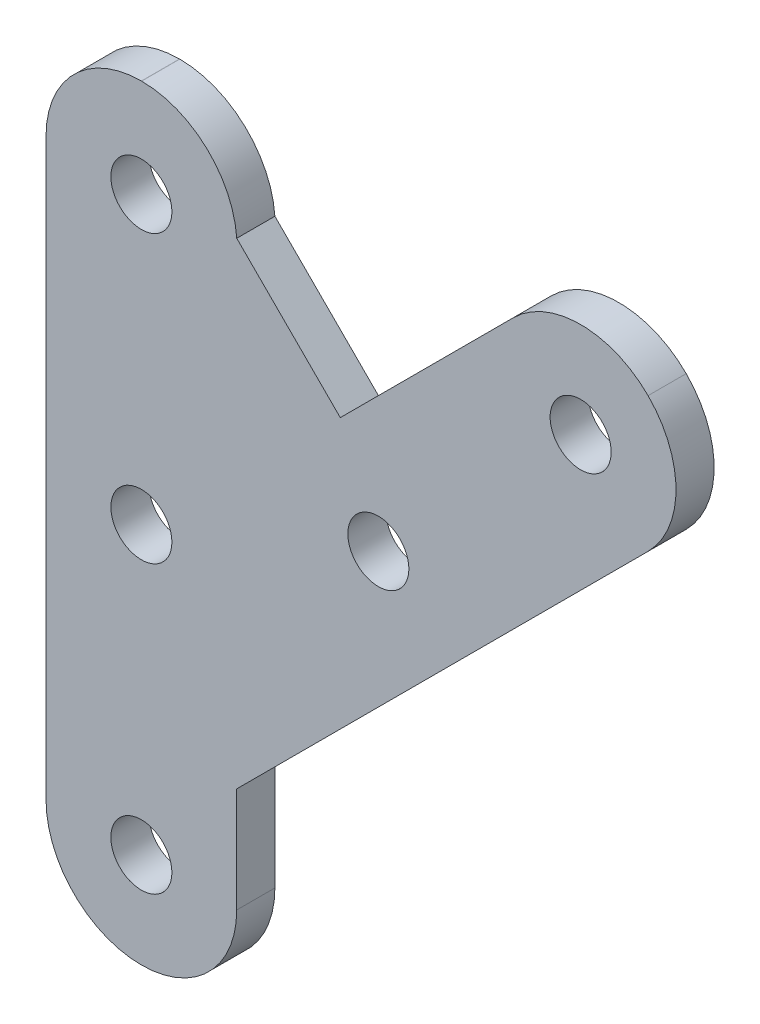
ISO-10303-21;
HEADER;
FILE_DESCRIPTION(('STEP AP214'),'2;1');
FILE_NAME('part.step','',(''),(''),'','','');
FILE_SCHEMA(('AUTOMOTIVE_DESIGN { 1 0 10303 214 1 1 1 1 }'));
ENDSEC;
DATA;
#1=APPLICATION_CONTEXT('core data for automotive mechanical design processes');
#2=APPLICATION_PROTOCOL_DEFINITION('international standard','automotive_design',2000,#1);
#3=PRODUCT_CONTEXT('',#1,'mechanical');
#4=PRODUCT('Part','Part','',(#3));
#5=PRODUCT_RELATED_PRODUCT_CATEGORY('part','',(#4));
#6=PRODUCT_DEFINITION_FORMATION('','',#4);
#7=PRODUCT_DEFINITION_CONTEXT('part definition',#1,'design');
#8=PRODUCT_DEFINITION('design','',#6,#7);
#9=PRODUCT_DEFINITION_SHAPE('','',#8);
#10=(LENGTH_UNIT() NAMED_UNIT(*) SI_UNIT(.MILLI.,.METRE.));
#11=(NAMED_UNIT(*) PLANE_ANGLE_UNIT() SI_UNIT($,.RADIAN.));
#12=(NAMED_UNIT(*) SI_UNIT($,.STERADIAN.) SOLID_ANGLE_UNIT());
#13=UNCERTAINTY_MEASURE_WITH_UNIT(LENGTH_MEASURE(1.E-05),#10,'distance_accuracy_value','');
#14=(GEOMETRIC_REPRESENTATION_CONTEXT(3) GLOBAL_UNCERTAINTY_ASSIGNED_CONTEXT((#13)) GLOBAL_UNIT_ASSIGNED_CONTEXT((#10,
#11,#12)) REPRESENTATION_CONTEXT('',''));
#15=CARTESIAN_POINT('',(0.,0.,0.));
#16=DIRECTION('',(0.,0.,1.));
#17=DIRECTION('',(1.,0.,0.));
#18=AXIS2_PLACEMENT_3D('',#15,#16,#17);
#19=CARTESIAN_POINT('',(0.,20.3649332642843,1.));
#20=DIRECTION('',(0.,-1.,0.));
#21=DIRECTION('',(1.,0.,0.));
#22=AXIS2_PLACEMENT_3D('',#19,#20,#21);
#23=PLANE('',#22);
#24=DIRECTION('',(-1.,0.,0.));
#25=VECTOR('',#24,1.);
#26=CARTESIAN_POINT('',(0.,20.3649332642843,1.));
#27=LINE('',#26,#25);
#28=CARTESIAN_POINT('',(1.18496642914092,20.3649332642843,1.));
#29=VERTEX_POINT('',#28);
#30=CARTESIAN_POINT('',(1.17214329468291,20.3649332642843,1.));
#31=VERTEX_POINT('',#30);
#32=EDGE_CURVE('E176',#29,#31,#27,.T.);
#33=ORIENTED_EDGE('',*,*,#32,.F.);
#34=DIRECTION('',(0.,0.,-1.));
#35=VECTOR('',#34,1.);
#36=CARTESIAN_POINT('',(1.18496642914092,20.3649332642843,1.));
#37=LINE('',#36,#35);
#38=CARTESIAN_POINT('',(1.18496642914092,20.3649332642843,-1.));
#39=VERTEX_POINT('',#38);
#40=EDGE_CURVE('E182',#29,#39,#37,.T.);
#41=ORIENTED_EDGE('',*,*,#40,.T.);
#42=DIRECTION('',(-1.,0.,0.));
#43=VECTOR('',#42,1.);
#44=CARTESIAN_POINT('',(0.,20.3649332642843,-1.));
#45=LINE('',#44,#43);
#46=CARTESIAN_POINT('',(1.17214329468291,20.3649332642843,-1.));
#47=VERTEX_POINT('',#46);
#48=EDGE_CURVE('E161',#39,#47,#45,.T.);
#49=ORIENTED_EDGE('',*,*,#48,.T.);
#50=DIRECTION('',(0.,0.,-1.));
#51=VECTOR('',#50,1.);
#52=CARTESIAN_POINT('',(1.17214329468291,20.3649332642843,1.));
#53=LINE('',#52,#51);
#54=EDGE_CURVE('E146',#47,#31,#53,.F.);
#55=ORIENTED_EDGE('',*,*,#54,.T.);
#56=EDGE_LOOP('',(#33,#41,#49,#55));
#57=FACE_BOUND('',#56,.T.);
#58=ADVANCED_FACE('F40',(#57),#23,.F.);
#59=CARTESIAN_POINT('',(-3.82785670531709,0.,1.));
#60=DIRECTION('',(-1.,0.,0.));
#61=DIRECTION('',(0.,-1.,0.));
#62=AXIS2_PLACEMENT_3D('',#59,#60,#61);
#63=PLANE('',#62);
#64=DIRECTION('',(0.,1.,0.));
#65=VECTOR('',#64,1.);
#66=CARTESIAN_POINT('',(-3.82785670531709,0.,1.));
#67=LINE('',#66,#65);
#68=CARTESIAN_POINT('',(-3.82785670531709,-14.7772023594462,1.));
#69=VERTEX_POINT('',#68);
#70=CARTESIAN_POINT('',(-3.82785670531709,15.3649332642843,1.));
#71=VERTEX_POINT('',#70);
#72=EDGE_CURVE('E136',#69,#71,#67,.T.);
#73=ORIENTED_EDGE('',*,*,#72,.T.);
#74=DIRECTION('',(0.,0.,-1.));
#75=VECTOR('',#74,1.);
#76=CARTESIAN_POINT('',(-3.82785670531709,15.3649332642843,-1.));
#77=LINE('',#76,#75);
#78=CARTESIAN_POINT('',(-3.82785670531709,15.3649332642843,-1.));
#79=VERTEX_POINT('',#78);
#80=EDGE_CURVE('E209',#71,#79,#77,.T.);
#81=ORIENTED_EDGE('',*,*,#80,.T.);
#82=DIRECTION('',(0.,1.,0.));
#83=VECTOR('',#82,1.);
#84=CARTESIAN_POINT('',(-3.82785670531709,0.,-1.));
#85=LINE('',#84,#83);
#86=CARTESIAN_POINT('',(-3.82785670531709,-14.7772023594462,-1.));
#87=VERTEX_POINT('',#86);
#88=EDGE_CURVE('E164',#87,#79,#85,.T.);
#89=ORIENTED_EDGE('',*,*,#88,.F.);
#90=DIRECTION('',(0.,0.,-1.));
#91=VECTOR('',#90,1.);
#92=CARTESIAN_POINT('',(-3.82785670531709,-14.7772023594462,1.));
#93=LINE('',#92,#91);
#94=EDGE_CURVE('E206',#87,#69,#93,.F.);
#95=ORIENTED_EDGE('',*,*,#94,.T.);
#96=EDGE_LOOP('',(#73,#81,#89,#95));
#97=FACE_BOUND('',#96,.T.);
#98=ADVANCED_FACE('F260',(#97),#63,.T.);
#99=CARTESIAN_POINT('',(6.17214329468292,0.,1.));
#100=DIRECTION('',(-1.,0.,0.));
#101=DIRECTION('',(0.,0.,1.));
#102=AXIS2_PLACEMENT_3D('',#99,#100,#101);
#103=PLANE('',#102);
#104=DIRECTION('',(0.,1.,0.));
#105=VECTOR('',#104,1.);
#106=CARTESIAN_POINT('',(6.17214329468292,0.,1.));
#107=LINE('',#106,#105);
#108=CARTESIAN_POINT('',(6.17214329468292,-14.7772023594462,1.));
#109=VERTEX_POINT('',#108);
#110=CARTESIAN_POINT('',(6.17214329468292,-9.27720235944622,1.));
#111=VERTEX_POINT('',#110);
#112=EDGE_CURVE('E126',#109,#111,#107,.T.);
#113=ORIENTED_EDGE('',*,*,#112,.F.);
#114=DIRECTION('',(0.,0.,-1.));
#115=VECTOR('',#114,1.);
#116=CARTESIAN_POINT('',(6.17214329468292,-14.7772023594462,1.));
#117=LINE('',#116,#115);
#118=CARTESIAN_POINT('',(6.17214329468292,-14.7772023594462,-1.));
#119=VERTEX_POINT('',#118);
#120=EDGE_CURVE('E212',#109,#119,#117,.T.);
#121=ORIENTED_EDGE('',*,*,#120,.T.);
#122=DIRECTION('',(0.,1.,0.));
#123=VECTOR('',#122,1.);
#124=CARTESIAN_POINT('',(6.17214329468292,0.,-1.));
#125=LINE('',#124,#123);
#126=CARTESIAN_POINT('',(6.17214329468292,-9.27720235944622,-1.));
#127=VERTEX_POINT('',#126);
#128=EDGE_CURVE('E142',#119,#127,#125,.T.);
#129=ORIENTED_EDGE('',*,*,#128,.T.);
#130=DIRECTION('',(0.,0.,-1.));
#131=VECTOR('',#130,1.);
#132=CARTESIAN_POINT('',(6.17214329468292,-9.27720235944622,1.));
#133=LINE('',#132,#131);
#134=EDGE_CURVE('E139',#111,#127,#133,.T.);
#135=ORIENTED_EDGE('',*,*,#134,.F.);
#136=EDGE_LOOP('',(#113,#121,#129,#135));
#137=FACE_BOUND('',#136,.T.);
#138=ADVANCED_FACE('F140',(#137),#103,.F.);
#139=CARTESIAN_POINT('',(7.72467282706457,-7.72467282706457,1.));
#140=DIRECTION('',(-0.707106781186547,0.707106781186547,0.));
#141=DIRECTION('',(-0.707106781186548,-0.707106781186548,0.));
#142=AXIS2_PLACEMENT_3D('',#139,#140,#141);
#143=PLANE('',#142);
#144=DIRECTION('',(0.707106781186548,0.707106781186548,0.));
#145=VECTOR('',#144,1.);
#146=CARTESIAN_POINT('',(7.72467282706457,-7.72467282706457,-1.));
#147=LINE('',#146,#145);
#148=CARTESIAN_POINT('',(27.7389001208726,12.2895544667435,-1.));
#149=VERTEX_POINT('',#148);
#150=EDGE_CURVE('E169',#127,#149,#147,.T.);
#151=ORIENTED_EDGE('',*,*,#150,.T.);
#152=DIRECTION('',(0.,0.,-1.));
#153=VECTOR('',#152,1.);
#154=CARTESIAN_POINT('',(27.7389001208726,12.2895544667435,1.));
#155=LINE('',#154,#153);
#156=CARTESIAN_POINT('',(27.7389001208726,12.2895544667435,1.));
#157=VERTEX_POINT('',#156);
#158=EDGE_CURVE('E49',#149,#157,#155,.F.);
#159=ORIENTED_EDGE('',*,*,#158,.T.);
#160=DIRECTION('',(0.707106781186548,0.707106781186548,0.));
#161=VECTOR('',#160,1.);
#162=CARTESIAN_POINT('',(7.72467282706457,-7.72467282706457,1.));
#163=LINE('',#162,#161);
#164=EDGE_CURVE('E131',#111,#157,#163,.T.);
#165=ORIENTED_EDGE('',*,*,#164,.F.);
#166=ORIENTED_EDGE('',*,*,#134,.T.);
#167=EDGE_LOOP('',(#151,#159,#165,#166));
#168=FACE_BOUND('',#167,.T.);
#169=ADVANCED_FACE('F150',(#168),#143,.F.);
#170=CARTESIAN_POINT('',(0.653605015199267,-0.653605015199257,1.));
#171=DIRECTION('',(0.707106781186553,-0.707106781186543,0.));
#172=DIRECTION('',(0.707106781186542,0.707106781186553,0.));
#173=AXIS2_PLACEMENT_3D('',#170,#171,#172);
#174=PLANE('',#173);
#175=DIRECTION('',(-0.707106781186542,-0.707106781186553,0.));
#176=VECTOR('',#175,1.);
#177=CARTESIAN_POINT('',(0.653605015199267,-0.653605015199257,1.));
#178=LINE('',#177,#176);
#179=CARTESIAN_POINT('',(20.6678323090071,19.3606222786089,1.));
#180=VERTEX_POINT('',#179);
#181=CARTESIAN_POINT('',(11.6010754828176,10.2938654524192,1.));
#182=VERTEX_POINT('',#181);
#183=EDGE_CURVE('E152',#180,#182,#178,.T.);
#184=ORIENTED_EDGE('',*,*,#183,.F.);
#185=DIRECTION('',(0.,0.,-1.));
#186=VECTOR('',#185,1.);
#187=CARTESIAN_POINT('',(20.6678323090071,19.3606222786089,1.));
#188=LINE('',#187,#186);
#189=CARTESIAN_POINT('',(20.6678323090071,19.3606222786089,-1.));
#190=VERTEX_POINT('',#189);
#191=EDGE_CURVE('E12',#180,#190,#188,.T.);
#192=ORIENTED_EDGE('',*,*,#191,.T.);
#193=DIRECTION('',(-0.707106781186542,-0.707106781186553,0.));
#194=VECTOR('',#193,1.);
#195=CARTESIAN_POINT('',(0.653605015199267,-0.653605015199257,-1.));
#196=LINE('',#195,#194);
#197=CARTESIAN_POINT('',(11.6010754828176,10.2938654524192,-1.));
#198=VERTEX_POINT('',#197);
#199=EDGE_CURVE('E171',#190,#198,#196,.T.);
#200=ORIENTED_EDGE('',*,*,#199,.T.);
#201=DIRECTION('',(0.,0.,-1.));
#202=VECTOR('',#201,1.);
#203=CARTESIAN_POINT('',(11.6010754828176,10.2938654524192,1.));
#204=LINE('',#203,#202);
#205=EDGE_CURVE('E147',#182,#198,#204,.T.);
#206=ORIENTED_EDGE('',*,*,#205,.F.);
#207=EDGE_LOOP('',(#184,#192,#200,#206));
#208=FACE_BOUND('',#207,.T.);
#209=ADVANCED_FACE('F282',(#208),#174,.F.);
#210=CARTESIAN_POINT('',(10.9474704676183,10.9474704676185,1.));
#211=DIRECTION('',(0.707106781186543,0.707106781186553,0.));
#212=DIRECTION('',(-0.707106781186553,0.707106781186542,0.));
#213=AXIS2_PLACEMENT_3D('',#210,#211,#212);
#214=PLANE('',#213);
#215=DIRECTION('',(0.707106781186553,-0.707106781186542,0.));
#216=VECTOR('',#215,1.);
#217=CARTESIAN_POINT('',(10.9474704676183,10.9474704676185,-1.));
#218=LINE('',#217,#216);
#219=CARTESIAN_POINT('',(6.17214329468292,15.7227976405538,-1.));
#220=VERTEX_POINT('',#219);
#221=EDGE_CURVE('E173',#220,#198,#218,.T.);
#222=ORIENTED_EDGE('',*,*,#221,.F.);
#223=DIRECTION('',(0.,0.,-1.));
#224=VECTOR('',#223,1.);
#225=CARTESIAN_POINT('',(6.17214329468292,15.7227976405538,1.));
#226=LINE('',#225,#224);
#227=CARTESIAN_POINT('',(6.17214329468292,15.7227976405538,1.));
#228=VERTEX_POINT('',#227);
#229=EDGE_CURVE('E160',#228,#220,#226,.T.);
#230=ORIENTED_EDGE('',*,*,#229,.F.);
#231=DIRECTION('',(0.707106781186553,-0.707106781186542,0.));
#232=VECTOR('',#231,1.);
#233=CARTESIAN_POINT('',(10.9474704676183,10.9474704676185,1.));
#234=LINE('',#233,#232);
#235=EDGE_CURVE('E154',#228,#182,#234,.T.);
#236=ORIENTED_EDGE('',*,*,#235,.T.);
#237=ORIENTED_EDGE('',*,*,#205,.T.);
#238=EDGE_LOOP('',(#222,#230,#236,#237));
#239=FACE_BOUND('',#238,.T.);
#240=ADVANCED_FACE('F279',(#239),#214,.T.);
#241=CARTESIAN_POINT('',(0.,0.,1.));
#242=DIRECTION('',(0.,0.,1.));
#243=DIRECTION('',(1.,0.,0.));
#244=AXIS2_PLACEMENT_3D('',#241,#242,#243);
#245=PLANE('',#244);
#246=CARTESIAN_POINT('',(1.17142269378928,-14.7772023594462,1.));
#247=DIRECTION('',(0.,0.,1.));
#248=DIRECTION('',(1.,0.,0.));
#249=AXIS2_PLACEMENT_3D('',#246,#247,#248);
#250=CIRCLE('',#249,1.6);
#251=CARTESIAN_POINT('',(2.77142269378928,-14.7772023594462,1.));
#252=VERTEX_POINT('',#251);
#253=EDGE_CURVE('E224',#252,#252,#250,.T.);
#254=ORIENTED_EDGE('',*,*,#253,.F.);
#255=EDGE_LOOP('',(#254));
#256=FACE_BOUND('',#255,.T.);
#257=CARTESIAN_POINT('',(13.5967644971417,5.21848665487799,1.));
#258=DIRECTION('',(0.,0.,1.));
#259=DIRECTION('',(1.,0.,0.));
#260=AXIS2_PLACEMENT_3D('',#257,#258,#259);
#261=CIRCLE('',#260,1.6);
#262=CARTESIAN_POINT('',(15.1967644971417,5.21848665487799,1.));
#263=VERTEX_POINT('',#262);
#264=EDGE_CURVE('E229',#263,#263,#261,.T.);
#265=ORIENTED_EDGE('',*,*,#264,.F.);
#266=EDGE_LOOP('',(#265));
#267=FACE_BOUND('',#266,.T.);
#268=CARTESIAN_POINT('',(24.2033662149398,15.8250883726763,1.));
#269=DIRECTION('',(0.,0.,1.));
#270=DIRECTION('',(1.,0.,0.));
#271=AXIS2_PLACEMENT_3D('',#268,#269,#270);
#272=CIRCLE('',#271,1.6);
#273=CARTESIAN_POINT('',(25.8033662149398,15.8250883726763,1.));
#274=VERTEX_POINT('',#273);
#275=EDGE_CURVE('E237',#274,#274,#272,.T.);
#276=ORIENTED_EDGE('',*,*,#275,.F.);
#277=EDGE_LOOP('',(#276));
#278=FACE_BOUND('',#277,.T.);
#279=CARTESIAN_POINT('',(1.17142269378928,0.222797640553772,1.));
#280=DIRECTION('',(0.,0.,1.));
#281=DIRECTION('',(1.,0.,0.));
#282=AXIS2_PLACEMENT_3D('',#279,#280,#281);
#283=CIRCLE('',#282,1.6);
#284=CARTESIAN_POINT('',(2.77142269378928,0.222797640553772,1.));
#285=VERTEX_POINT('',#284);
#286=EDGE_CURVE('E243',#285,#285,#283,.T.);
#287=ORIENTED_EDGE('',*,*,#286,.F.);
#288=EDGE_LOOP('',(#287));
#289=FACE_BOUND('',#288,.T.);
#290=CARTESIAN_POINT('',(1.17142269378928,15.2227976405538,1.));
#291=DIRECTION('',(0.,0.,1.));
#292=DIRECTION('',(1.,0.,0.));
#293=AXIS2_PLACEMENT_3D('',#290,#291,#292);
#294=CIRCLE('',#293,1.6);
#295=CARTESIAN_POINT('',(2.77142269378928,15.2227976405538,1.));
#296=VERTEX_POINT('',#295);
#297=EDGE_CURVE('E249',#296,#296,#294,.T.);
#298=ORIENTED_EDGE('',*,*,#297,.F.);
#299=EDGE_LOOP('',(#298));
#300=FACE_BOUND('',#299,.T.);
#301=ORIENTED_EDGE('',*,*,#235,.F.);
#302=CARTESIAN_POINT('',(1.18496642914092,15.3649332642843,1.));
#303=DIRECTION('',(0.,0.,1.));
#304=DIRECTION('',(1.,0.,0.));
#305=AXIS2_PLACEMENT_3D('',#302,#303,#304);
#306=CIRCLE('',#305,5.);
#307=EDGE_CURVE('E204',#228,#29,#306,.T.);
#308=ORIENTED_EDGE('',*,*,#307,.T.);
#309=ORIENTED_EDGE('',*,*,#32,.T.);
#310=CARTESIAN_POINT('',(1.17214329468291,15.3649332642843,1.));
#311=DIRECTION('',(0.,0.,1.));
#312=DIRECTION('',(1.,0.,0.));
#313=AXIS2_PLACEMENT_3D('',#310,#311,#312);
#314=CIRCLE('',#313,5.);
#315=EDGE_CURVE('E202',#31,#71,#314,.T.);
#316=ORIENTED_EDGE('',*,*,#315,.T.);
#317=ORIENTED_EDGE('',*,*,#72,.F.);
#318=CARTESIAN_POINT('',(1.17214329468291,-14.7772023594462,1.));
#319=DIRECTION('',(0.,0.,1.));
#320=DIRECTION('',(1.,0.,0.));
#321=AXIS2_PLACEMENT_3D('',#318,#319,#320);
#322=CIRCLE('',#321,5.);
#323=CARTESIAN_POINT('',(1.17214329468292,-19.7772023594462,1.));
#324=VERTEX_POINT('',#323);
#325=EDGE_CURVE('E200',#69,#324,#322,.T.);
#326=ORIENTED_EDGE('',*,*,#325,.T.);
#327=CARTESIAN_POINT('',(1.17214329468292,-14.7772023594462,1.));
#328=DIRECTION('',(0.,0.,1.));
#329=DIRECTION('',(1.,0.,0.));
#330=AXIS2_PLACEMENT_3D('',#327,#328,#329);
#331=CIRCLE('',#330,5.);
#332=EDGE_CURVE('E133',#324,#109,#331,.T.);
#333=ORIENTED_EDGE('',*,*,#332,.T.);
#334=ORIENTED_EDGE('',*,*,#112,.T.);
#335=ORIENTED_EDGE('',*,*,#164,.T.);
#336=CARTESIAN_POINT('',(24.2033662149399,15.8250883726762,1.));
#337=DIRECTION('',(0.,0.,1.));
#338=DIRECTION('',(1.,0.,0.));
#339=AXIS2_PLACEMENT_3D('',#336,#337,#338);
#340=CIRCLE('',#339,5.);
#341=CARTESIAN_POINT('',(27.7389001208726,19.3606222786089,1.));
#342=VERTEX_POINT('',#341);
#343=EDGE_CURVE('E62',#157,#342,#340,.T.);
#344=ORIENTED_EDGE('',*,*,#343,.T.);
#345=CARTESIAN_POINT('',(24.2033662149399,15.8250883726762,1.));
#346=DIRECTION('',(0.,0.,1.));
#347=DIRECTION('',(1.,0.,0.));
#348=AXIS2_PLACEMENT_3D('',#345,#346,#347);
#349=CIRCLE('',#348,5.);
#350=EDGE_CURVE('E57',#342,#180,#349,.T.);
#351=ORIENTED_EDGE('',*,*,#350,.T.);
#352=ORIENTED_EDGE('',*,*,#183,.T.);
#353=EDGE_LOOP('',(#301,#308,#309,#316,#317,#326,#333,#334,#335,#344,#351,#352));
#354=FACE_BOUND('',#353,.T.);
#355=ADVANCED_FACE('F129',(#256,#267,#278,#289,#300,#354),#245,.T.);
#356=CARTESIAN_POINT('',(0.,0.,-1.));
#357=DIRECTION('',(0.,0.,1.));
#358=DIRECTION('',(1.,0.,0.));
#359=AXIS2_PLACEMENT_3D('',#356,#357,#358);
#360=PLANE('',#359);
#361=CARTESIAN_POINT('',(1.17142269378928,-14.7772023594462,-1.));
#362=DIRECTION('',(0.,0.,1.));
#363=DIRECTION('',(1.,0.,0.));
#364=AXIS2_PLACEMENT_3D('',#361,#362,#363);
#365=CIRCLE('',#364,1.6);
#366=CARTESIAN_POINT('',(2.77142269378928,-14.7772023594462,-1.));
#367=VERTEX_POINT('',#366);
#368=EDGE_CURVE('E219',#367,#367,#365,.T.);
#369=ORIENTED_EDGE('',*,*,#368,.T.);
#370=EDGE_LOOP('',(#369));
#371=FACE_BOUND('',#370,.T.);
#372=CARTESIAN_POINT('',(13.5967644971417,5.21848665487799,-1.));
#373=DIRECTION('',(0.,0.,1.));
#374=DIRECTION('',(1.,0.,0.));
#375=AXIS2_PLACEMENT_3D('',#372,#373,#374);
#376=CIRCLE('',#375,1.6);
#377=CARTESIAN_POINT('',(15.1967644971417,5.21848665487799,-1.));
#378=VERTEX_POINT('',#377);
#379=EDGE_CURVE('E234',#378,#378,#376,.T.);
#380=ORIENTED_EDGE('',*,*,#379,.T.);
#381=EDGE_LOOP('',(#380));
#382=FACE_BOUND('',#381,.T.);
#383=CARTESIAN_POINT('',(24.2033662149398,15.8250883726763,-1.));
#384=DIRECTION('',(0.,0.,1.));
#385=DIRECTION('',(1.,0.,0.));
#386=AXIS2_PLACEMENT_3D('',#383,#384,#385);
#387=CIRCLE('',#386,1.6);
#388=CARTESIAN_POINT('',(25.8033662149398,15.8250883726763,-1.));
#389=VERTEX_POINT('',#388);
#390=EDGE_CURVE('E240',#389,#389,#387,.T.);
#391=ORIENTED_EDGE('',*,*,#390,.T.);
#392=EDGE_LOOP('',(#391));
#393=FACE_BOUND('',#392,.T.);
#394=CARTESIAN_POINT('',(1.17142269378928,0.222797640553772,-1.));
#395=DIRECTION('',(0.,0.,1.));
#396=DIRECTION('',(1.,0.,0.));
#397=AXIS2_PLACEMENT_3D('',#394,#395,#396);
#398=CIRCLE('',#397,1.6);
#399=CARTESIAN_POINT('',(2.77142269378928,0.222797640553772,-1.));
#400=VERTEX_POINT('',#399);
#401=EDGE_CURVE('E246',#400,#400,#398,.T.);
#402=ORIENTED_EDGE('',*,*,#401,.T.);
#403=EDGE_LOOP('',(#402));
#404=FACE_BOUND('',#403,.T.);
#405=CARTESIAN_POINT('',(1.17142269378928,15.2227976405538,-1.));
#406=DIRECTION('',(0.,0.,1.));
#407=DIRECTION('',(1.,0.,0.));
#408=AXIS2_PLACEMENT_3D('',#405,#406,#407);
#409=CIRCLE('',#408,1.6);
#410=CARTESIAN_POINT('',(2.77142269378928,15.2227976405538,-1.));
#411=VERTEX_POINT('',#410);
#412=EDGE_CURVE('E252',#411,#411,#409,.T.);
#413=ORIENTED_EDGE('',*,*,#412,.T.);
#414=EDGE_LOOP('',(#413));
#415=FACE_BOUND('',#414,.T.);
#416=ORIENTED_EDGE('',*,*,#48,.F.);
#417=CARTESIAN_POINT('',(1.18496642914092,15.3649332642843,-1.));
#418=DIRECTION('',(0.,0.,1.));
#419=DIRECTION('',(1.,0.,0.));
#420=AXIS2_PLACEMENT_3D('',#417,#418,#419);
#421=CIRCLE('',#420,5.);
#422=EDGE_CURVE('E195',#39,#220,#421,.F.);
#423=ORIENTED_EDGE('',*,*,#422,.T.);
#424=ORIENTED_EDGE('',*,*,#221,.T.);
#425=ORIENTED_EDGE('',*,*,#199,.F.);
#426=CARTESIAN_POINT('',(24.2033662149399,15.8250883726762,-1.));
#427=DIRECTION('',(0.,0.,1.));
#428=DIRECTION('',(1.,0.,0.));
#429=AXIS2_PLACEMENT_3D('',#426,#427,#428);
#430=CIRCLE('',#429,5.);
#431=CARTESIAN_POINT('',(27.7389001208726,19.3606222786089,-1.));
#432=VERTEX_POINT('',#431);
#433=EDGE_CURVE('E185',#190,#432,#430,.F.);
#434=ORIENTED_EDGE('',*,*,#433,.T.);
#435=CARTESIAN_POINT('',(24.2033662149399,15.8250883726762,-1.));
#436=DIRECTION('',(0.,0.,1.));
#437=DIRECTION('',(1.,0.,0.));
#438=AXIS2_PLACEMENT_3D('',#435,#436,#437);
#439=CIRCLE('',#438,5.);
#440=EDGE_CURVE('E187',#432,#149,#439,.F.);
#441=ORIENTED_EDGE('',*,*,#440,.T.);
#442=ORIENTED_EDGE('',*,*,#150,.F.);
#443=ORIENTED_EDGE('',*,*,#128,.F.);
#444=CARTESIAN_POINT('',(1.17214329468292,-14.7772023594462,-1.));
#445=DIRECTION('',(0.,0.,1.));
#446=DIRECTION('',(1.,0.,0.));
#447=AXIS2_PLACEMENT_3D('',#444,#445,#446);
#448=CIRCLE('',#447,5.);
#449=CARTESIAN_POINT('',(1.17214329468292,-19.7772023594462,-1.));
#450=VERTEX_POINT('',#449);
#451=EDGE_CURVE('E189',#119,#450,#448,.F.);
#452=ORIENTED_EDGE('',*,*,#451,.T.);
#453=CARTESIAN_POINT('',(1.17214329468291,-14.7772023594462,-1.));
#454=DIRECTION('',(0.,0.,1.));
#455=DIRECTION('',(1.,0.,0.));
#456=AXIS2_PLACEMENT_3D('',#453,#454,#455);
#457=CIRCLE('',#456,5.);
#458=EDGE_CURVE('E191',#450,#87,#457,.F.);
#459=ORIENTED_EDGE('',*,*,#458,.T.);
#460=ORIENTED_EDGE('',*,*,#88,.T.);
#461=CARTESIAN_POINT('',(1.17214329468291,15.3649332642843,-1.));
#462=DIRECTION('',(0.,0.,1.));
#463=DIRECTION('',(1.,0.,0.));
#464=AXIS2_PLACEMENT_3D('',#461,#462,#463);
#465=CIRCLE('',#464,5.);
#466=EDGE_CURVE('E193',#79,#47,#465,.F.);
#467=ORIENTED_EDGE('',*,*,#466,.T.);
#468=EDGE_LOOP('',(#416,#423,#424,#425,#434,#441,#442,#443,#452,#459,#460,#467));
#469=FACE_BOUND('',#468,.T.);
#470=ADVANCED_FACE('F269',(#371,#382,#393,#404,#415,#469),#360,.F.);
#471=CARTESIAN_POINT('',(1.18496642914092,15.3649332642843,1.));
#472=DIRECTION('',(0.,0.,-1.));
#473=DIRECTION('',(-1.,0.,0.));
#474=AXIS2_PLACEMENT_3D('',#471,#472,#473);
#475=CYLINDRICAL_SURFACE('',#474,5.);
#476=ORIENTED_EDGE('',*,*,#307,.F.);
#477=ORIENTED_EDGE('',*,*,#229,.T.);
#478=ORIENTED_EDGE('',*,*,#422,.F.);
#479=ORIENTED_EDGE('',*,*,#40,.F.);
#480=EDGE_LOOP('',(#476,#477,#478,#479));
#481=FACE_BOUND('',#480,.T.);
#482=ADVANCED_FACE('F275',(#481),#475,.T.);
#483=CARTESIAN_POINT('',(1.17214329468291,15.3649332642843,1.));
#484=DIRECTION('',(0.,0.,1.));
#485=DIRECTION('',(1.,0.,0.));
#486=AXIS2_PLACEMENT_3D('',#483,#484,#485);
#487=CYLINDRICAL_SURFACE('',#486,5.);
#488=ORIENTED_EDGE('',*,*,#315,.F.);
#489=ORIENTED_EDGE('',*,*,#54,.F.);
#490=ORIENTED_EDGE('',*,*,#466,.F.);
#491=ORIENTED_EDGE('',*,*,#80,.F.);
#492=EDGE_LOOP('',(#488,#489,#490,#491));
#493=FACE_BOUND('',#492,.T.);
#494=ADVANCED_FACE('F265',(#493),#487,.T.);
#495=CARTESIAN_POINT('',(1.17214329468292,-14.7772023594462,1.));
#496=DIRECTION('',(0.,0.,-1.));
#497=DIRECTION('',(-1.,0.,0.));
#498=AXIS2_PLACEMENT_3D('',#495,#496,#497);
#499=CYLINDRICAL_SURFACE('',#498,5.);
#500=ORIENTED_EDGE('',*,*,#120,.F.);
#501=ORIENTED_EDGE('',*,*,#332,.F.);
#502=DIRECTION('',(0.,0.,-1.));
#503=VECTOR('',#502,1.);
#504=CARTESIAN_POINT('',(1.17214329468292,-19.7772023594462,1.));
#505=LINE('',#504,#503);
#506=EDGE_CURVE('E165',#450,#324,#505,.F.);
#507=ORIENTED_EDGE('',*,*,#506,.F.);
#508=ORIENTED_EDGE('',*,*,#451,.F.);
#509=EDGE_LOOP('',(#500,#501,#507,#508));
#510=FACE_BOUND('',#509,.T.);
#511=ADVANCED_FACE('F289',(#510),#499,.T.);
#512=CARTESIAN_POINT('',(1.17214329468291,-14.7772023594462,1.));
#513=DIRECTION('',(0.,0.,1.));
#514=DIRECTION('',(1.,0.,0.));
#515=AXIS2_PLACEMENT_3D('',#512,#513,#514);
#516=CYLINDRICAL_SURFACE('',#515,5.);
#517=ORIENTED_EDGE('',*,*,#325,.F.);
#518=ORIENTED_EDGE('',*,*,#94,.F.);
#519=ORIENTED_EDGE('',*,*,#458,.F.);
#520=ORIENTED_EDGE('',*,*,#506,.T.);
#521=EDGE_LOOP('',(#517,#518,#519,#520));
#522=FACE_BOUND('',#521,.T.);
#523=ADVANCED_FACE('F290',(#522),#516,.T.);
#524=CARTESIAN_POINT('',(24.2033662149399,15.8250883726762,1.));
#525=DIRECTION('',(0.,0.,-1.));
#526=DIRECTION('',(-1.,0.,0.));
#527=AXIS2_PLACEMENT_3D('',#524,#525,#526);
#528=CYLINDRICAL_SURFACE('',#527,5.);
#529=ORIENTED_EDGE('',*,*,#191,.F.);
#530=ORIENTED_EDGE('',*,*,#350,.F.);
#531=DIRECTION('',(0.,0.,-1.));
#532=VECTOR('',#531,1.);
#533=CARTESIAN_POINT('',(27.7389001208726,19.3606222786089,1.));
#534=LINE('',#533,#532);
#535=EDGE_CURVE('E44',#432,#342,#534,.F.);
#536=ORIENTED_EDGE('',*,*,#535,.F.);
#537=ORIENTED_EDGE('',*,*,#433,.F.);
#538=EDGE_LOOP('',(#529,#530,#536,#537));
#539=FACE_BOUND('',#538,.T.);
#540=ADVANCED_FACE('F42',(#539),#528,.T.);
#541=CARTESIAN_POINT('',(24.2033662149399,15.8250883726762,1.));
#542=DIRECTION('',(0.,0.,-1.));
#543=DIRECTION('',(-1.,0.,0.));
#544=AXIS2_PLACEMENT_3D('',#541,#542,#543);
#545=CYLINDRICAL_SURFACE('',#544,5.);
#546=ORIENTED_EDGE('',*,*,#343,.F.);
#547=ORIENTED_EDGE('',*,*,#158,.F.);
#548=ORIENTED_EDGE('',*,*,#440,.F.);
#549=ORIENTED_EDGE('',*,*,#535,.T.);
#550=EDGE_LOOP('',(#546,#547,#548,#549));
#551=FACE_BOUND('',#550,.T.);
#552=ADVANCED_FACE('F286',(#551),#545,.T.);
#553=CARTESIAN_POINT('',(1.17142269378928,15.2227976405538,-1.));
#554=DIRECTION('',(0.,0.,1.));
#555=DIRECTION('',(1.,0.,0.));
#556=AXIS2_PLACEMENT_3D('',#553,#554,#555);
#557=CYLINDRICAL_SURFACE('',#556,1.6);
#558=ORIENTED_EDGE('',*,*,#412,.F.);
#559=EDGE_LOOP('',(#558));
#560=FACE_BOUND('',#559,.T.);
#561=ORIENTED_EDGE('',*,*,#297,.T.);
#562=EDGE_LOOP('',(#561));
#563=FACE_BOUND('',#562,.T.);
#564=ADVANCED_FACE('F337',(#560,#563),#557,.F.);
#565=CARTESIAN_POINT('',(1.17142269378928,0.222797640553772,-1.));
#566=DIRECTION('',(0.,0.,1.));
#567=DIRECTION('',(1.,0.,0.));
#568=AXIS2_PLACEMENT_3D('',#565,#566,#567);
#569=CYLINDRICAL_SURFACE('',#568,1.6);
#570=ORIENTED_EDGE('',*,*,#401,.F.);
#571=EDGE_LOOP('',(#570));
#572=FACE_BOUND('',#571,.T.);
#573=ORIENTED_EDGE('',*,*,#286,.T.);
#574=EDGE_LOOP('',(#573));
#575=FACE_BOUND('',#574,.T.);
#576=ADVANCED_FACE('F366',(#572,#575),#569,.F.);
#577=CARTESIAN_POINT('',(24.2033662149398,15.8250883726763,-1.));
#578=DIRECTION('',(0.,0.,1.));
#579=DIRECTION('',(1.,0.,0.));
#580=AXIS2_PLACEMENT_3D('',#577,#578,#579);
#581=CYLINDRICAL_SURFACE('',#580,1.6);
#582=ORIENTED_EDGE('',*,*,#390,.F.);
#583=EDGE_LOOP('',(#582));
#584=FACE_BOUND('',#583,.T.);
#585=ORIENTED_EDGE('',*,*,#275,.T.);
#586=EDGE_LOOP('',(#585));
#587=FACE_BOUND('',#586,.T.);
#588=ADVANCED_FACE('F376',(#584,#587),#581,.F.);
#589=CARTESIAN_POINT('',(13.5967644971417,5.21848665487799,-1.));
#590=DIRECTION('',(0.,0.,1.));
#591=DIRECTION('',(1.,0.,0.));
#592=AXIS2_PLACEMENT_3D('',#589,#590,#591);
#593=CYLINDRICAL_SURFACE('',#592,1.6);
#594=ORIENTED_EDGE('',*,*,#379,.F.);
#595=EDGE_LOOP('',(#594));
#596=FACE_BOUND('',#595,.T.);
#597=ORIENTED_EDGE('',*,*,#264,.T.);
#598=EDGE_LOOP('',(#597));
#599=FACE_BOUND('',#598,.T.);
#600=ADVANCED_FACE('F386',(#596,#599),#593,.F.);
#601=CARTESIAN_POINT('',(1.17142269378928,-14.7772023594462,-1.));
#602=DIRECTION('',(0.,0.,1.));
#603=DIRECTION('',(1.,0.,0.));
#604=AXIS2_PLACEMENT_3D('',#601,#602,#603);
#605=CYLINDRICAL_SURFACE('',#604,1.6);
#606=ORIENTED_EDGE('',*,*,#368,.F.);
#607=EDGE_LOOP('',(#606));
#608=FACE_BOUND('',#607,.T.);
#609=ORIENTED_EDGE('',*,*,#253,.T.);
#610=EDGE_LOOP('',(#609));
#611=FACE_BOUND('',#610,.T.);
#612=ADVANCED_FACE('F396',(#608,#611),#605,.F.);
#613=CLOSED_SHELL('',(#58,#98,#138,#169,#209,#240,#355,#470,#482,#494,#511,#523,#540,#552,#564,
#576,#588,#600,#612));
#614=MANIFOLD_SOLID_BREP('B2',#613);
#615=ADVANCED_BREP_SHAPE_REPRESENTATION('',(#18,#614),#14);
#616=SHAPE_DEFINITION_REPRESENTATION(#9,#615);
ENDSEC;
END-ISO-10303-21;
